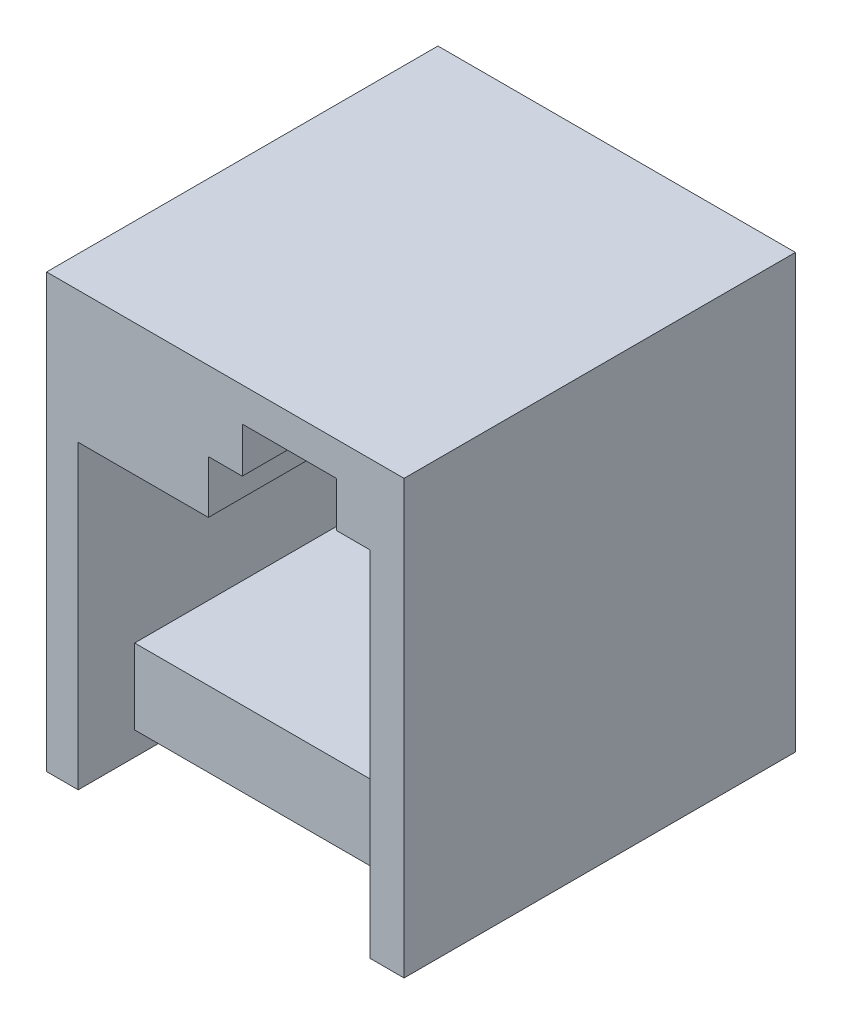
ISO-10303-21;
HEADER;
FILE_DESCRIPTION(('STEP AP214'),'2;1');
FILE_NAME('part.step','',(''),(''),'','','');
FILE_SCHEMA(('AUTOMOTIVE_DESIGN { 1 0 10303 214 1 1 1 1 }'));
ENDSEC;
DATA;
#1=APPLICATION_CONTEXT('core data for automotive mechanical design processes');
#2=APPLICATION_PROTOCOL_DEFINITION('international standard','automotive_design',2000,#1);
#3=PRODUCT_CONTEXT('',#1,'mechanical');
#4=PRODUCT('Part','Part','',(#3));
#5=PRODUCT_RELATED_PRODUCT_CATEGORY('part','',(#4));
#6=PRODUCT_DEFINITION_FORMATION('','',#4);
#7=PRODUCT_DEFINITION_CONTEXT('part definition',#1,'design');
#8=PRODUCT_DEFINITION('design','',#6,#7);
#9=PRODUCT_DEFINITION_SHAPE('','',#8);
#10=(LENGTH_UNIT() NAMED_UNIT(*) SI_UNIT(.MILLI.,.METRE.));
#11=(NAMED_UNIT(*) PLANE_ANGLE_UNIT() SI_UNIT($,.RADIAN.));
#12=(NAMED_UNIT(*) SI_UNIT($,.STERADIAN.) SOLID_ANGLE_UNIT());
#13=UNCERTAINTY_MEASURE_WITH_UNIT(LENGTH_MEASURE(1.E-05),#10,'distance_accuracy_value','');
#14=(GEOMETRIC_REPRESENTATION_CONTEXT(3) GLOBAL_UNCERTAINTY_ASSIGNED_CONTEXT((#13)) GLOBAL_UNIT_ASSIGNED_CONTEXT((#10,
#11,#12)) REPRESENTATION_CONTEXT('',''));
#15=CARTESIAN_POINT('',(0.,0.,0.));
#16=DIRECTION('',(0.,0.,1.));
#17=DIRECTION('',(1.,0.,0.));
#18=AXIS2_PLACEMENT_3D('',#15,#16,#17);
#19=CARTESIAN_POINT('',(6.0325,0.800100000000001,-9.271));
#20=DIRECTION('',(0.,-1.,0.));
#21=DIRECTION('',(1.,0.,0.));
#22=AXIS2_PLACEMENT_3D('',#19,#20,#21);
#23=PLANE('',#22);
#24=DIRECTION('',(1.,0.,0.));
#25=VECTOR('',#24,1.);
#26=CARTESIAN_POINT('',(1.0668,0.800100000000001,0.127));
#27=LINE('',#26,#25);
#28=CARTESIAN_POINT('',(1.0668,0.800100000000001,0.127));
#29=VERTEX_POINT('',#28);
#30=CARTESIAN_POINT('',(10.922,0.800100000000001,0.127));
#31=VERTEX_POINT('',#30);
#32=EDGE_CURVE('E201',#29,#31,#27,.T.);
#33=ORIENTED_EDGE('',*,*,#32,.F.);
#34=DIRECTION('',(0.,0.,1.));
#35=VECTOR('',#34,1.);
#36=CARTESIAN_POINT('',(1.0668,0.800100000000001,-9.271));
#37=LINE('',#36,#35);
#38=CARTESIAN_POINT('',(1.0668,0.800100000000001,-9.271));
#39=VERTEX_POINT('',#38);
#40=EDGE_CURVE('E299',#39,#29,#37,.T.);
#41=ORIENTED_EDGE('',*,*,#40,.F.);
#42=DIRECTION('',(1.,0.,0.));
#43=VECTOR('',#42,1.);
#44=CARTESIAN_POINT('',(6.0325,0.800100000000001,-9.271));
#45=LINE('',#44,#43);
#46=CARTESIAN_POINT('',(10.922,0.8001,-9.271));
#47=VERTEX_POINT('',#46);
#48=EDGE_CURVE('E222',#39,#47,#45,.T.);
#49=ORIENTED_EDGE('',*,*,#48,.T.);
#50=DIRECTION('',(0.,0.,1.));
#51=VECTOR('',#50,1.);
#52=CARTESIAN_POINT('',(10.922,0.8001,-9.271));
#53=LINE('',#52,#51);
#54=EDGE_CURVE('E295',#47,#31,#53,.T.);
#55=ORIENTED_EDGE('',*,*,#54,.T.);
#56=EDGE_LOOP('',(#33,#41,#49,#55));
#57=FACE_BOUND('',#56,.T.);
#58=ADVANCED_FACE('F34',(#57),#23,.T.);
#59=CARTESIAN_POINT('',(6.0325,3.3401,-9.271));
#60=DIRECTION('',(0.,1.,0.));
#61=DIRECTION('',(-1.,0.,0.));
#62=AXIS2_PLACEMENT_3D('',#59,#60,#61);
#63=PLANE('',#62);
#64=DIRECTION('',(-1.,0.,0.));
#65=VECTOR('',#64,1.);
#66=CARTESIAN_POINT('',(1.0668,3.3401,0.127));
#67=LINE('',#66,#65);
#68=CARTESIAN_POINT('',(10.922,3.3401,0.127));
#69=VERTEX_POINT('',#68);
#70=CARTESIAN_POINT('',(1.0668,3.3401,0.127));
#71=VERTEX_POINT('',#70);
#72=EDGE_CURVE('E206',#69,#71,#67,.T.);
#73=ORIENTED_EDGE('',*,*,#72,.F.);
#74=DIRECTION('',(0.,0.,1.));
#75=VECTOR('',#74,1.);
#76=CARTESIAN_POINT('',(10.922,3.3401,-9.271));
#77=LINE('',#76,#75);
#78=CARTESIAN_POINT('',(10.922,3.3401,-9.271));
#79=VERTEX_POINT('',#78);
#80=EDGE_CURVE('E302',#79,#69,#77,.T.);
#81=ORIENTED_EDGE('',*,*,#80,.F.);
#82=DIRECTION('',(-1.,0.,0.));
#83=VECTOR('',#82,1.);
#84=CARTESIAN_POINT('',(6.0325,3.3401,-9.271));
#85=LINE('',#84,#83);
#86=CARTESIAN_POINT('',(1.0668,3.3401,-9.271));
#87=VERTEX_POINT('',#86);
#88=EDGE_CURVE('E209',#79,#87,#85,.T.);
#89=ORIENTED_EDGE('',*,*,#88,.T.);
#90=DIRECTION('',(0.,0.,1.));
#91=VECTOR('',#90,1.);
#92=CARTESIAN_POINT('',(1.0668,3.3401,-9.271));
#93=LINE('',#92,#91);
#94=EDGE_CURVE('E271',#87,#71,#93,.T.);
#95=ORIENTED_EDGE('',*,*,#94,.T.);
#96=EDGE_LOOP('',(#73,#81,#89,#95));
#97=FACE_BOUND('',#96,.T.);
#98=ADVANCED_FACE('F347',(#97),#63,.T.);
#99=CARTESIAN_POINT('',(1.0668,0.,2.032));
#100=DIRECTION('',(-1.,0.,0.));
#101=DIRECTION('',(0.,0.,1.));
#102=AXIS2_PLACEMENT_3D('',#99,#100,#101);
#103=PLANE('',#102);
#104=DIRECTION('',(0.,0.,-1.));
#105=VECTOR('',#104,1.);
#106=CARTESIAN_POINT('',(1.0668,10.16,2.032));
#107=LINE('',#106,#105);
#108=CARTESIAN_POINT('',(1.0668,10.16,2.032));
#109=VERTEX_POINT('',#108);
#110=CARTESIAN_POINT('',(1.0668,10.16,-9.271));
#111=VERTEX_POINT('',#110);
#112=EDGE_CURVE('E44',#109,#111,#107,.T.);
#113=ORIENTED_EDGE('',*,*,#112,.F.);
#114=DIRECTION('',(0.,1.,0.));
#115=VECTOR('',#114,1.);
#116=CARTESIAN_POINT('',(1.0668,0.,2.032));
#117=LINE('',#116,#115);
#118=CARTESIAN_POINT('',(1.0668,0.,2.032));
#119=VERTEX_POINT('',#118);
#120=EDGE_CURVE('E307',#119,#109,#117,.T.);
#121=ORIENTED_EDGE('',*,*,#120,.F.);
#122=DIRECTION('',(0.,0.,-1.));
#123=VECTOR('',#122,1.);
#124=CARTESIAN_POINT('',(1.0668,0.,2.032));
#125=LINE('',#124,#123);
#126=CARTESIAN_POINT('',(1.06680000000001,0.,-9.271));
#127=VERTEX_POINT('',#126);
#128=EDGE_CURVE('E11',#119,#127,#125,.T.);
#129=ORIENTED_EDGE('',*,*,#128,.T.);
#130=DIRECTION('',(0.,1.,0.));
#131=VECTOR('',#130,1.);
#132=CARTESIAN_POINT('',(1.0668,-7.57379499838301,-9.271));
#133=LINE('',#132,#131);
#134=EDGE_CURVE('E219',#127,#39,#133,.T.);
#135=ORIENTED_EDGE('',*,*,#134,.T.);
#136=ORIENTED_EDGE('',*,*,#40,.T.);
#137=DIRECTION('',(0.,-1.,0.));
#138=VECTOR('',#137,1.);
#139=CARTESIAN_POINT('',(1.0668,0.800100000000001,0.127));
#140=LINE('',#139,#138);
#141=EDGE_CURVE('E197',#71,#29,#140,.T.);
#142=ORIENTED_EDGE('',*,*,#141,.F.);
#143=ORIENTED_EDGE('',*,*,#94,.F.);
#144=EDGE_CURVE('E212',#87,#111,#133,.T.);
#145=ORIENTED_EDGE('',*,*,#144,.T.);
#146=EDGE_LOOP('',(#113,#121,#129,#135,#136,#142,#143,#145));
#147=FACE_BOUND('',#146,.T.);
#148=ADVANCED_FACE('F36',(#147),#103,.F.);
#149=CARTESIAN_POINT('',(1.0668,10.16,2.032));
#150=DIRECTION('',(0.,1.,0.));
#151=DIRECTION('',(0.,0.,1.));
#152=AXIS2_PLACEMENT_3D('',#149,#150,#151);
#153=PLANE('',#152);
#154=ORIENTED_EDGE('',*,*,#112,.T.);
#155=DIRECTION('',(1.,0.,0.));
#156=VECTOR('',#155,1.);
#157=CARTESIAN_POINT('',(6.0325,10.16,-9.271));
#158=LINE('',#157,#156);
#159=CARTESIAN_POINT('',(5.461,10.16,-9.271));
#160=VERTEX_POINT('',#159);
#161=EDGE_CURVE('E216',#111,#160,#158,.T.);
#162=ORIENTED_EDGE('',*,*,#161,.T.);
#163=DIRECTION('',(0.,0.,-1.));
#164=VECTOR('',#163,1.);
#165=CARTESIAN_POINT('',(5.461,10.16,2.032));
#166=LINE('',#165,#164);
#167=CARTESIAN_POINT('',(5.461,10.16,2.032));
#168=VERTEX_POINT('',#167);
#169=EDGE_CURVE('E255',#168,#160,#166,.T.);
#170=ORIENTED_EDGE('',*,*,#169,.F.);
#171=DIRECTION('',(1.,0.,0.));
#172=VECTOR('',#171,1.);
#173=CARTESIAN_POINT('',(1.0668,10.16,2.032));
#174=LINE('',#173,#172);
#175=EDGE_CURVE('E267',#109,#168,#174,.T.);
#176=ORIENTED_EDGE('',*,*,#175,.F.);
#177=EDGE_LOOP('',(#154,#162,#170,#176));
#178=FACE_BOUND('',#177,.T.);
#179=ADVANCED_FACE('F266',(#178),#153,.F.);
#180=CARTESIAN_POINT('',(5.461,10.16,2.032));
#181=DIRECTION('',(-1.,0.,0.));
#182=DIRECTION('',(0.,0.,1.));
#183=AXIS2_PLACEMENT_3D('',#180,#181,#182);
#184=PLANE('',#183);
#185=ORIENTED_EDGE('',*,*,#169,.T.);
#186=DIRECTION('',(0.,1.,0.));
#187=VECTOR('',#186,1.);
#188=CARTESIAN_POINT('',(5.461,-7.57379499838301,-9.271));
#189=LINE('',#188,#187);
#190=CARTESIAN_POINT('',(5.461,11.938,-9.271));
#191=VERTEX_POINT('',#190);
#192=EDGE_CURVE('E275',#160,#191,#189,.T.);
#193=ORIENTED_EDGE('',*,*,#192,.T.);
#194=DIRECTION('',(0.,0.,-1.));
#195=VECTOR('',#194,1.);
#196=CARTESIAN_POINT('',(5.461,11.938,2.032));
#197=LINE('',#196,#195);
#198=CARTESIAN_POINT('',(5.461,11.938,2.032));
#199=VERTEX_POINT('',#198);
#200=EDGE_CURVE('E253',#199,#191,#197,.T.);
#201=ORIENTED_EDGE('',*,*,#200,.F.);
#202=DIRECTION('',(0.,1.,0.));
#203=VECTOR('',#202,1.);
#204=CARTESIAN_POINT('',(5.461,10.16,2.032));
#205=LINE('',#204,#203);
#206=EDGE_CURVE('E310',#168,#199,#205,.T.);
#207=ORIENTED_EDGE('',*,*,#206,.F.);
#208=EDGE_LOOP('',(#185,#193,#201,#207));
#209=FACE_BOUND('',#208,.T.);
#210=ADVANCED_FACE('F368',(#209),#184,.F.);
#211=CARTESIAN_POINT('',(5.461,11.938,2.032));
#212=DIRECTION('',(0.,1.,0.));
#213=DIRECTION('',(0.,0.,1.));
#214=AXIS2_PLACEMENT_3D('',#211,#212,#213);
#215=PLANE('',#214);
#216=ORIENTED_EDGE('',*,*,#200,.T.);
#217=DIRECTION('',(1.,0.,0.));
#218=VECTOR('',#217,1.);
#219=CARTESIAN_POINT('',(6.0325,11.938,-9.271));
#220=LINE('',#219,#218);
#221=CARTESIAN_POINT('',(6.604,11.938,-9.271));
#222=VERTEX_POINT('',#221);
#223=EDGE_CURVE('E276',#191,#222,#220,.T.);
#224=ORIENTED_EDGE('',*,*,#223,.T.);
#225=DIRECTION('',(0.,0.,-1.));
#226=VECTOR('',#225,1.);
#227=CARTESIAN_POINT('',(6.604,11.938,2.032));
#228=LINE('',#227,#226);
#229=CARTESIAN_POINT('',(6.604,11.938,2.032));
#230=VERTEX_POINT('',#229);
#231=EDGE_CURVE('E250',#230,#222,#228,.T.);
#232=ORIENTED_EDGE('',*,*,#231,.F.);
#233=DIRECTION('',(1.,0.,0.));
#234=VECTOR('',#233,1.);
#235=CARTESIAN_POINT('',(5.461,11.938,2.032));
#236=LINE('',#235,#234);
#237=EDGE_CURVE('E312',#199,#230,#236,.T.);
#238=ORIENTED_EDGE('',*,*,#237,.F.);
#239=EDGE_LOOP('',(#216,#224,#232,#238));
#240=FACE_BOUND('',#239,.T.);
#241=ADVANCED_FACE('F367',(#240),#215,.F.);
#242=CARTESIAN_POINT('',(6.604,11.938,2.032));
#243=DIRECTION('',(-1.,0.,0.));
#244=DIRECTION('',(0.,0.,1.));
#245=AXIS2_PLACEMENT_3D('',#242,#243,#244);
#246=PLANE('',#245);
#247=ORIENTED_EDGE('',*,*,#231,.T.);
#248=DIRECTION('',(0.,1.,0.));
#249=VECTOR('',#248,1.);
#250=CARTESIAN_POINT('',(6.604,-7.57379499838301,-9.271));
#251=LINE('',#250,#249);
#252=CARTESIAN_POINT('',(6.604,13.462,-9.271));
#253=VERTEX_POINT('',#252);
#254=EDGE_CURVE('E279',#222,#253,#251,.T.);
#255=ORIENTED_EDGE('',*,*,#254,.T.);
#256=DIRECTION('',(0.,0.,-1.));
#257=VECTOR('',#256,1.);
#258=CARTESIAN_POINT('',(6.604,13.462,2.032));
#259=LINE('',#258,#257);
#260=CARTESIAN_POINT('',(6.604,13.462,2.032));
#261=VERTEX_POINT('',#260);
#262=EDGE_CURVE('E247',#261,#253,#259,.T.);
#263=ORIENTED_EDGE('',*,*,#262,.F.);
#264=DIRECTION('',(0.,1.,0.));
#265=VECTOR('',#264,1.);
#266=CARTESIAN_POINT('',(6.604,11.938,2.032));
#267=LINE('',#266,#265);
#268=EDGE_CURVE('E314',#230,#261,#267,.T.);
#269=ORIENTED_EDGE('',*,*,#268,.F.);
#270=EDGE_LOOP('',(#247,#255,#263,#269));
#271=FACE_BOUND('',#270,.T.);
#272=ADVANCED_FACE('F364',(#271),#246,.F.);
#273=CARTESIAN_POINT('',(6.604,13.462,2.032));
#274=DIRECTION('',(0.,1.,0.));
#275=DIRECTION('',(0.,0.,1.));
#276=AXIS2_PLACEMENT_3D('',#273,#274,#275);
#277=PLANE('',#276);
#278=ORIENTED_EDGE('',*,*,#262,.T.);
#279=DIRECTION('',(1.,0.,0.));
#280=VECTOR('',#279,1.);
#281=CARTESIAN_POINT('',(6.0325,13.462,-9.271));
#282=LINE('',#281,#280);
#283=CARTESIAN_POINT('',(9.779,13.462,-9.271));
#284=VERTEX_POINT('',#283);
#285=EDGE_CURVE('E284',#253,#284,#282,.T.);
#286=ORIENTED_EDGE('',*,*,#285,.T.);
#287=DIRECTION('',(0.,0.,-1.));
#288=VECTOR('',#287,1.);
#289=CARTESIAN_POINT('',(9.779,13.462,2.032));
#290=LINE('',#289,#288);
#291=CARTESIAN_POINT('',(9.779,13.462,2.032));
#292=VERTEX_POINT('',#291);
#293=EDGE_CURVE('E241',#292,#284,#290,.T.);
#294=ORIENTED_EDGE('',*,*,#293,.F.);
#295=DIRECTION('',(1.,0.,0.));
#296=VECTOR('',#295,1.);
#297=CARTESIAN_POINT('',(6.604,13.462,2.032));
#298=LINE('',#297,#296);
#299=EDGE_CURVE('E316',#261,#292,#298,.T.);
#300=ORIENTED_EDGE('',*,*,#299,.F.);
#301=EDGE_LOOP('',(#278,#286,#294,#300));
#302=FACE_BOUND('',#301,.T.);
#303=ADVANCED_FACE('F359',(#302),#277,.F.);
#304=CARTESIAN_POINT('',(9.779,13.462,2.032));
#305=DIRECTION('',(1.,0.,0.));
#306=DIRECTION('',(0.,0.,-1.));
#307=AXIS2_PLACEMENT_3D('',#304,#305,#306);
#308=PLANE('',#307);
#309=ORIENTED_EDGE('',*,*,#293,.T.);
#310=DIRECTION('',(0.,-1.,0.));
#311=VECTOR('',#310,1.);
#312=CARTESIAN_POINT('',(9.779,-7.57379499838301,-9.271));
#313=LINE('',#312,#311);
#314=CARTESIAN_POINT('',(9.779,11.938,-9.271));
#315=VERTEX_POINT('',#314);
#316=EDGE_CURVE('E287',#284,#315,#313,.T.);
#317=ORIENTED_EDGE('',*,*,#316,.T.);
#318=DIRECTION('',(0.,0.,-1.));
#319=VECTOR('',#318,1.);
#320=CARTESIAN_POINT('',(9.779,11.938,2.032));
#321=LINE('',#320,#319);
#322=CARTESIAN_POINT('',(9.779,11.938,2.032));
#323=VERTEX_POINT('',#322);
#324=EDGE_CURVE('E233',#323,#315,#321,.T.);
#325=ORIENTED_EDGE('',*,*,#324,.F.);
#326=DIRECTION('',(0.,-1.,0.));
#327=VECTOR('',#326,1.);
#328=CARTESIAN_POINT('',(9.779,13.462,2.032));
#329=LINE('',#328,#327);
#330=EDGE_CURVE('E318',#292,#323,#329,.T.);
#331=ORIENTED_EDGE('',*,*,#330,.F.);
#332=EDGE_LOOP('',(#309,#317,#325,#331));
#333=FACE_BOUND('',#332,.T.);
#334=ADVANCED_FACE('F355',(#333),#308,.F.);
#335=CARTESIAN_POINT('',(9.779,11.938,2.032));
#336=DIRECTION('',(0.,1.,0.));
#337=DIRECTION('',(0.,0.,1.));
#338=AXIS2_PLACEMENT_3D('',#335,#336,#337);
#339=PLANE('',#338);
#340=ORIENTED_EDGE('',*,*,#324,.T.);
#341=DIRECTION('',(1.,0.,0.));
#342=VECTOR('',#341,1.);
#343=CARTESIAN_POINT('',(6.0325,11.938,-9.271));
#344=LINE('',#343,#342);
#345=CARTESIAN_POINT('',(10.922,11.938,-9.271));
#346=VERTEX_POINT('',#345);
#347=EDGE_CURVE('E290',#315,#346,#344,.T.);
#348=ORIENTED_EDGE('',*,*,#347,.T.);
#349=DIRECTION('',(0.,0.,-1.));
#350=VECTOR('',#349,1.);
#351=CARTESIAN_POINT('',(10.922,11.938,2.032));
#352=LINE('',#351,#350);
#353=CARTESIAN_POINT('',(10.922,11.938,2.032));
#354=VERTEX_POINT('',#353);
#355=EDGE_CURVE('E228',#354,#346,#352,.T.);
#356=ORIENTED_EDGE('',*,*,#355,.F.);
#357=DIRECTION('',(1.,0.,0.));
#358=VECTOR('',#357,1.);
#359=CARTESIAN_POINT('',(9.779,11.938,2.032));
#360=LINE('',#359,#358);
#361=EDGE_CURVE('E320',#323,#354,#360,.T.);
#362=ORIENTED_EDGE('',*,*,#361,.F.);
#363=EDGE_LOOP('',(#340,#348,#356,#362));
#364=FACE_BOUND('',#363,.T.);
#365=ADVANCED_FACE('F352',(#364),#339,.F.);
#366=CARTESIAN_POINT('',(10.922,11.938,2.032));
#367=DIRECTION('',(1.,0.,0.));
#368=DIRECTION('',(0.,1.,0.));
#369=AXIS2_PLACEMENT_3D('',#366,#367,#368);
#370=PLANE('',#369);
#371=ORIENTED_EDGE('',*,*,#355,.T.);
#372=DIRECTION('',(0.,-1.,0.));
#373=VECTOR('',#372,1.);
#374=CARTESIAN_POINT('',(10.922,-7.57379499838301,-9.271));
#375=LINE('',#374,#373);
#376=EDGE_CURVE('E223',#346,#79,#375,.T.);
#377=ORIENTED_EDGE('',*,*,#376,.T.);
#378=ORIENTED_EDGE('',*,*,#80,.T.);
#379=DIRECTION('',(0.,1.,0.));
#380=VECTOR('',#379,1.);
#381=CARTESIAN_POINT('',(10.922,0.800100000000001,0.127));
#382=LINE('',#381,#380);
#383=EDGE_CURVE('E204',#31,#69,#382,.T.);
#384=ORIENTED_EDGE('',*,*,#383,.F.);
#385=ORIENTED_EDGE('',*,*,#54,.F.);
#386=CARTESIAN_POINT('',(10.922,0.,-9.271));
#387=VERTEX_POINT('',#386);
#388=EDGE_CURVE('E38',#47,#387,#375,.T.);
#389=ORIENTED_EDGE('',*,*,#388,.T.);
#390=DIRECTION('',(0.,0.,-1.));
#391=VECTOR('',#390,1.);
#392=CARTESIAN_POINT('',(10.922,0.,2.032));
#393=LINE('',#392,#391);
#394=CARTESIAN_POINT('',(10.922,0.,2.032));
#395=VERTEX_POINT('',#394);
#396=EDGE_CURVE('E172',#395,#387,#393,.T.);
#397=ORIENTED_EDGE('',*,*,#396,.F.);
#398=DIRECTION('',(0.,-1.,0.));
#399=VECTOR('',#398,1.);
#400=CARTESIAN_POINT('',(10.922,11.938,2.032));
#401=LINE('',#400,#399);
#402=EDGE_CURVE('E322',#354,#395,#401,.T.);
#403=ORIENTED_EDGE('',*,*,#402,.F.);
#404=EDGE_LOOP('',(#371,#377,#378,#384,#385,#389,#397,#403));
#405=FACE_BOUND('',#404,.T.);
#406=ADVANCED_FACE('F348',(#405),#370,.F.);
#407=CARTESIAN_POINT('',(12.065,0.,2.032));
#408=DIRECTION('',(0.,1.,0.));
#409=DIRECTION('',(-1.,0.,0.));
#410=AXIS2_PLACEMENT_3D('',#407,#408,#409);
#411=PLANE('',#410);
#412=ORIENTED_EDGE('',*,*,#396,.T.);
#413=DIRECTION('',(-1.,0.,0.));
#414=VECTOR('',#413,1.);
#415=CARTESIAN_POINT('',(12.065,0.,-9.271));
#416=LINE('',#415,#414);
#417=EDGE_CURVE('E190',#387,#127,#416,.T.);
#418=ORIENTED_EDGE('',*,*,#417,.T.);
#419=ORIENTED_EDGE('',*,*,#128,.F.);
#420=DIRECTION('',(1.,0.,0.));
#421=VECTOR('',#420,1.);
#422=CARTESIAN_POINT('',(1.0668,0.,2.032));
#423=LINE('',#422,#421);
#424=CARTESIAN_POINT('',(0.,0.,2.032));
#425=VERTEX_POINT('',#424);
#426=EDGE_CURVE('E298',#425,#119,#423,.T.);
#427=ORIENTED_EDGE('',*,*,#426,.F.);
#428=DIRECTION('',(0.,0.,-1.));
#429=VECTOR('',#428,1.);
#430=CARTESIAN_POINT('',(0.,0.,2.032));
#431=LINE('',#430,#429);
#432=CARTESIAN_POINT('',(0.,0.,-11.176));
#433=VERTEX_POINT('',#432);
#434=EDGE_CURVE('E180',#425,#433,#431,.T.);
#435=ORIENTED_EDGE('',*,*,#434,.T.);
#436=DIRECTION('',(-1.,0.,0.));
#437=VECTOR('',#436,1.);
#438=CARTESIAN_POINT('',(12.065,0.,-11.176));
#439=LINE('',#438,#437);
#440=CARTESIAN_POINT('',(12.065,0.,-11.176));
#441=VERTEX_POINT('',#440);
#442=EDGE_CURVE('E176',#441,#433,#439,.T.);
#443=ORIENTED_EDGE('',*,*,#442,.F.);
#444=DIRECTION('',(0.,0.,-1.));
#445=VECTOR('',#444,1.);
#446=CARTESIAN_POINT('',(12.065,0.,2.032));
#447=LINE('',#446,#445);
#448=CARTESIAN_POINT('',(12.065,0.,2.032));
#449=VERTEX_POINT('',#448);
#450=EDGE_CURVE('E163',#449,#441,#447,.T.);
#451=ORIENTED_EDGE('',*,*,#450,.F.);
#452=DIRECTION('',(1.,0.,0.));
#453=VECTOR('',#452,1.);
#454=CARTESIAN_POINT('',(12.065,0.,2.032));
#455=LINE('',#454,#453);
#456=EDGE_CURVE('E324',#395,#449,#455,.T.);
#457=ORIENTED_EDGE('',*,*,#456,.F.);
#458=EDGE_LOOP('',(#412,#418,#419,#427,#435,#443,#451,#457));
#459=FACE_BOUND('',#458,.T.);
#460=ADVANCED_FACE('F178',(#459),#411,.F.);
#461=CARTESIAN_POINT('',(12.065,14.605,2.032));
#462=DIRECTION('',(-1.,0.,0.));
#463=DIRECTION('',(0.,0.,1.));
#464=AXIS2_PLACEMENT_3D('',#461,#462,#463);
#465=PLANE('',#464);
#466=ORIENTED_EDGE('',*,*,#450,.T.);
#467=DIRECTION('',(0.,-1.,0.));
#468=VECTOR('',#467,1.);
#469=CARTESIAN_POINT('',(12.065,14.605,-11.176));
#470=LINE('',#469,#468);
#471=CARTESIAN_POINT('',(12.065,14.605,-11.176));
#472=VERTEX_POINT('',#471);
#473=EDGE_CURVE('E168',#472,#441,#470,.T.);
#474=ORIENTED_EDGE('',*,*,#473,.F.);
#475=DIRECTION('',(0.,0.,-1.));
#476=VECTOR('',#475,1.);
#477=CARTESIAN_POINT('',(12.065,14.605,2.032));
#478=LINE('',#477,#476);
#479=CARTESIAN_POINT('',(12.065,14.605,2.032));
#480=VERTEX_POINT('',#479);
#481=EDGE_CURVE('E173',#480,#472,#478,.T.);
#482=ORIENTED_EDGE('',*,*,#481,.F.);
#483=DIRECTION('',(0.,1.,0.));
#484=VECTOR('',#483,1.);
#485=CARTESIAN_POINT('',(12.065,14.605,2.032));
#486=LINE('',#485,#484);
#487=EDGE_CURVE('E169',#449,#480,#486,.T.);
#488=ORIENTED_EDGE('',*,*,#487,.F.);
#489=EDGE_LOOP('',(#466,#474,#482,#488));
#490=FACE_BOUND('',#489,.T.);
#491=ADVANCED_FACE('F165',(#490),#465,.F.);
#492=CARTESIAN_POINT('',(0.,14.605,2.032));
#493=DIRECTION('',(0.,-1.,0.));
#494=DIRECTION('',(0.,0.,-1.));
#495=AXIS2_PLACEMENT_3D('',#492,#493,#494);
#496=PLANE('',#495);
#497=ORIENTED_EDGE('',*,*,#481,.T.);
#498=DIRECTION('',(1.,0.,0.));
#499=VECTOR('',#498,1.);
#500=CARTESIAN_POINT('',(12.065,14.605,-11.176));
#501=LINE('',#500,#499);
#502=CARTESIAN_POINT('',(0.,14.605,-11.176));
#503=VERTEX_POINT('',#502);
#504=EDGE_CURVE('E189',#503,#472,#501,.T.);
#505=ORIENTED_EDGE('',*,*,#504,.F.);
#506=DIRECTION('',(0.,0.,-1.));
#507=VECTOR('',#506,1.);
#508=CARTESIAN_POINT('',(0.,14.605,2.032));
#509=LINE('',#508,#507);
#510=CARTESIAN_POINT('',(0.,14.605,2.032));
#511=VERTEX_POINT('',#510);
#512=EDGE_CURVE('E330',#511,#503,#509,.T.);
#513=ORIENTED_EDGE('',*,*,#512,.F.);
#514=DIRECTION('',(-1.,0.,0.));
#515=VECTOR('',#514,1.);
#516=CARTESIAN_POINT('',(0.,14.605,2.032));
#517=LINE('',#516,#515);
#518=EDGE_CURVE('E57',#480,#511,#517,.T.);
#519=ORIENTED_EDGE('',*,*,#518,.F.);
#520=EDGE_LOOP('',(#497,#505,#513,#519));
#521=FACE_BOUND('',#520,.T.);
#522=ADVANCED_FACE('F332',(#521),#496,.F.);
#523=CARTESIAN_POINT('',(0.,0.,2.032));
#524=DIRECTION('',(1.,0.,0.));
#525=DIRECTION('',(0.,1.,0.));
#526=AXIS2_PLACEMENT_3D('',#523,#524,#525);
#527=PLANE('',#526);
#528=ORIENTED_EDGE('',*,*,#512,.T.);
#529=DIRECTION('',(0.,1.,0.));
#530=VECTOR('',#529,1.);
#531=CARTESIAN_POINT('',(0.,14.605,-11.176));
#532=LINE('',#531,#530);
#533=EDGE_CURVE('E184',#433,#503,#532,.T.);
#534=ORIENTED_EDGE('',*,*,#533,.F.);
#535=ORIENTED_EDGE('',*,*,#434,.F.);
#536=DIRECTION('',(0.,-1.,0.));
#537=VECTOR('',#536,1.);
#538=CARTESIAN_POINT('',(0.,0.,2.032));
#539=LINE('',#538,#537);
#540=EDGE_CURVE('E52',#511,#425,#539,.T.);
#541=ORIENTED_EDGE('',*,*,#540,.F.);
#542=EDGE_LOOP('',(#528,#534,#535,#541));
#543=FACE_BOUND('',#542,.T.);
#544=ADVANCED_FACE('F334',(#543),#527,.F.);
#545=CARTESIAN_POINT('',(0.,0.,2.032));
#546=DIRECTION('',(0.,0.,-1.));
#547=DIRECTION('',(-1.,0.,0.));
#548=AXIS2_PLACEMENT_3D('',#545,#546,#547);
#549=PLANE('',#548);
#550=ORIENTED_EDGE('',*,*,#120,.T.);
#551=ORIENTED_EDGE('',*,*,#175,.T.);
#552=ORIENTED_EDGE('',*,*,#206,.T.);
#553=ORIENTED_EDGE('',*,*,#237,.T.);
#554=ORIENTED_EDGE('',*,*,#268,.T.);
#555=ORIENTED_EDGE('',*,*,#299,.T.);
#556=ORIENTED_EDGE('',*,*,#330,.T.);
#557=ORIENTED_EDGE('',*,*,#361,.T.);
#558=ORIENTED_EDGE('',*,*,#402,.T.);
#559=ORIENTED_EDGE('',*,*,#456,.T.);
#560=ORIENTED_EDGE('',*,*,#487,.T.);
#561=ORIENTED_EDGE('',*,*,#518,.T.);
#562=ORIENTED_EDGE('',*,*,#540,.T.);
#563=ORIENTED_EDGE('',*,*,#426,.T.);
#564=EDGE_LOOP('',(#550,#551,#552,#553,#554,#555,#556,#557,#558,#559,#560,#561,#562,#563));
#565=FACE_BOUND('',#564,.T.);
#566=ADVANCED_FACE('F336',(#565),#549,.F.);
#567=CARTESIAN_POINT('',(1.0668,3.3401,0.127));
#568=DIRECTION('',(0.,0.,-1.));
#569=DIRECTION('',(-1.,0.,0.));
#570=AXIS2_PLACEMENT_3D('',#567,#568,#569);
#571=PLANE('',#570);
#572=ORIENTED_EDGE('',*,*,#141,.T.);
#573=ORIENTED_EDGE('',*,*,#32,.T.);
#574=ORIENTED_EDGE('',*,*,#383,.T.);
#575=ORIENTED_EDGE('',*,*,#72,.T.);
#576=EDGE_LOOP('',(#572,#573,#574,#575));
#577=FACE_BOUND('',#576,.T.);
#578=ADVANCED_FACE('F344',(#577),#571,.F.);
#579=CARTESIAN_POINT('',(12.065,0.,-9.271));
#580=DIRECTION('',(0.,0.,-1.));
#581=DIRECTION('',(-1.,0.,0.));
#582=AXIS2_PLACEMENT_3D('',#579,#580,#581);
#583=PLANE('',#582);
#584=ORIENTED_EDGE('',*,*,#388,.F.);
#585=ORIENTED_EDGE('',*,*,#48,.F.);
#586=ORIENTED_EDGE('',*,*,#134,.F.);
#587=ORIENTED_EDGE('',*,*,#417,.F.);
#588=EDGE_LOOP('',(#584,#585,#586,#587));
#589=FACE_BOUND('',#588,.T.);
#590=ADVANCED_FACE('F339',(#589),#583,.F.);
#591=CARTESIAN_POINT('',(12.065,0.,-11.176));
#592=DIRECTION('',(0.,0.,-1.));
#593=DIRECTION('',(-1.,0.,0.));
#594=AXIS2_PLACEMENT_3D('',#591,#592,#593);
#595=PLANE('',#594);
#596=ORIENTED_EDGE('',*,*,#473,.T.);
#597=ORIENTED_EDGE('',*,*,#442,.T.);
#598=ORIENTED_EDGE('',*,*,#533,.T.);
#599=ORIENTED_EDGE('',*,*,#504,.T.);
#600=EDGE_LOOP('',(#596,#597,#598,#599));
#601=FACE_BOUND('',#600,.T.);
#602=ADVANCED_FACE('F187',(#601),#595,.T.);
#603=ORIENTED_EDGE('',*,*,#88,.F.);
#604=ORIENTED_EDGE('',*,*,#376,.F.);
#605=ORIENTED_EDGE('',*,*,#347,.F.);
#606=ORIENTED_EDGE('',*,*,#316,.F.);
#607=ORIENTED_EDGE('',*,*,#285,.F.);
#608=ORIENTED_EDGE('',*,*,#254,.F.);
#609=ORIENTED_EDGE('',*,*,#223,.F.);
#610=ORIENTED_EDGE('',*,*,#192,.F.);
#611=ORIENTED_EDGE('',*,*,#161,.F.);
#612=ORIENTED_EDGE('',*,*,#144,.F.);
#613=EDGE_LOOP('',(#603,#604,#605,#606,#607,#608,#609,#610,#611,#612));
#614=FACE_BOUND('',#613,.T.);
#615=ADVANCED_FACE('F273',(#614),#583,.F.);
#616=CLOSED_SHELL('',(#58,#98,#148,#179,#210,#241,#272,#303,#334,#365,#406,#460,#491,#522,#544,
#566,#578,#590,#602,#615));
#617=MANIFOLD_SOLID_BREP('B2',#616);
#618=ADVANCED_BREP_SHAPE_REPRESENTATION('',(#18,#617),#14);
#619=SHAPE_DEFINITION_REPRESENTATION(#9,#618);
ENDSEC;
END-ISO-10303-21;
